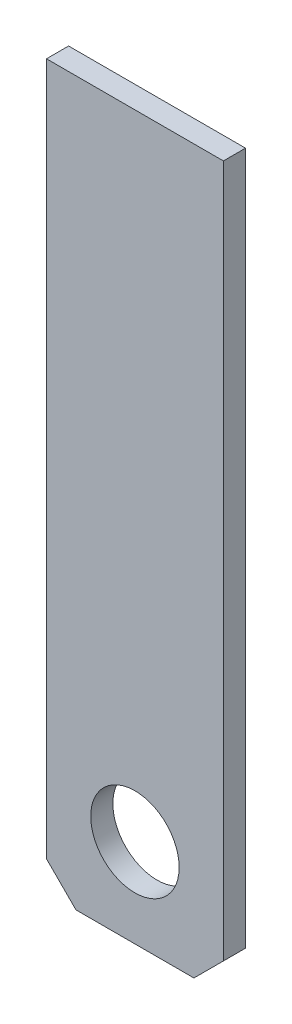
ISO-10303-21;
HEADER;
FILE_DESCRIPTION(('STEP AP214'),'2;1');
FILE_NAME('part.step','',(''),(''),'','','');
FILE_SCHEMA(('AUTOMOTIVE_DESIGN { 1 0 10303 214 1 1 1 1 }'));
ENDSEC;
DATA;
#1=APPLICATION_CONTEXT('core data for automotive mechanical design processes');
#2=APPLICATION_PROTOCOL_DEFINITION('international standard','automotive_design',2000,#1);
#3=PRODUCT_CONTEXT('',#1,'mechanical');
#4=PRODUCT('Part','Part','',(#3));
#5=PRODUCT_RELATED_PRODUCT_CATEGORY('part','',(#4));
#6=PRODUCT_DEFINITION_FORMATION('','',#4);
#7=PRODUCT_DEFINITION_CONTEXT('part definition',#1,'design');
#8=PRODUCT_DEFINITION('design','',#6,#7);
#9=PRODUCT_DEFINITION_SHAPE('','',#8);
#10=(LENGTH_UNIT() NAMED_UNIT(*) SI_UNIT(.MILLI.,.METRE.));
#11=(NAMED_UNIT(*) PLANE_ANGLE_UNIT() SI_UNIT($,.RADIAN.));
#12=(NAMED_UNIT(*) SI_UNIT($,.STERADIAN.) SOLID_ANGLE_UNIT());
#13=UNCERTAINTY_MEASURE_WITH_UNIT(LENGTH_MEASURE(1.E-05),#10,'distance_accuracy_value','');
#14=(GEOMETRIC_REPRESENTATION_CONTEXT(3) GLOBAL_UNCERTAINTY_ASSIGNED_CONTEXT((#13)) GLOBAL_UNIT_ASSIGNED_CONTEXT((#10,
#11,#12)) REPRESENTATION_CONTEXT('',''));
#15=CARTESIAN_POINT('',(0.,0.,0.));
#16=DIRECTION('',(0.,0.,1.));
#17=DIRECTION('',(1.,0.,0.));
#18=AXIS2_PLACEMENT_3D('',#15,#16,#17);
#19=CARTESIAN_POINT('',(0.,18.5,1.5));
#20=DIRECTION('',(0.,0.,1.));
#21=DIRECTION('',(1.,0.,0.));
#22=AXIS2_PLACEMENT_3D('',#19,#20,#21);
#23=PLANE('',#22);
#24=CARTESIAN_POINT('',(0.,0.,1.5));
#25=DIRECTION('',(0.,0.,1.));
#26=DIRECTION('',(1.,0.,0.));
#27=AXIS2_PLACEMENT_3D('',#24,#25,#26);
#28=CIRCLE('',#27,3.);
#29=CARTESIAN_POINT('',(3.,0.,1.5));
#30=VERTEX_POINT('',#29);
#31=EDGE_CURVE('E20',#30,#30,#28,.F.);
#32=ORIENTED_EDGE('',*,*,#31,.T.);
#33=EDGE_LOOP('',(#32));
#34=FACE_BOUND('',#33,.T.);
#35=DIRECTION('',(0.707106781186548,-0.707106781186547,0.));
#36=VECTOR('',#35,1.);
#37=CARTESIAN_POINT('',(-5.,-5.,1.5));
#38=LINE('',#37,#36);
#39=CARTESIAN_POINT('',(-4.,-6.,1.5));
#40=VERTEX_POINT('',#39);
#41=CARTESIAN_POINT('',(-6.00000000000001,-4.,1.5));
#42=VERTEX_POINT('',#41);
#43=EDGE_CURVE('E97',#40,#42,#38,.F.);
#44=ORIENTED_EDGE('',*,*,#43,.F.);
#45=DIRECTION('',(1.,0.,0.));
#46=VECTOR('',#45,1.);
#47=CARTESIAN_POINT('',(6.,-6.,1.5));
#48=LINE('',#47,#46);
#49=CARTESIAN_POINT('',(4.,-6.,1.5));
#50=VERTEX_POINT('',#49);
#51=EDGE_CURVE('E101',#50,#40,#48,.F.);
#52=ORIENTED_EDGE('',*,*,#51,.F.);
#53=DIRECTION('',(0.707106781186548,0.707106781186547,0.));
#54=VECTOR('',#53,1.);
#55=CARTESIAN_POINT('',(5.,-5.,1.5));
#56=LINE('',#55,#54);
#57=CARTESIAN_POINT('',(6.,-4.,1.5));
#58=VERTEX_POINT('',#57);
#59=EDGE_CURVE('E85',#58,#50,#56,.F.);
#60=ORIENTED_EDGE('',*,*,#59,.F.);
#61=DIRECTION('',(0.,1.,0.));
#62=VECTOR('',#61,1.);
#63=CARTESIAN_POINT('',(5.99999999999999,43.,1.5));
#64=LINE('',#63,#62);
#65=CARTESIAN_POINT('',(6.,43.,1.5));
#66=VERTEX_POINT('',#65);
#67=EDGE_CURVE('E80',#66,#58,#64,.F.);
#68=ORIENTED_EDGE('',*,*,#67,.F.);
#69=DIRECTION('',(1.,0.,0.));
#70=VECTOR('',#69,1.);
#71=CARTESIAN_POINT('',(-6.00000000000001,43.,1.5));
#72=LINE('',#71,#70);
#73=CARTESIAN_POINT('',(-6.00000000000001,43.,1.5));
#74=VERTEX_POINT('',#73);
#75=EDGE_CURVE('E71',#74,#66,#72,.T.);
#76=ORIENTED_EDGE('',*,*,#75,.F.);
#77=DIRECTION('',(0.,1.,0.));
#78=VECTOR('',#77,1.);
#79=CARTESIAN_POINT('',(-6.,-6.,1.5));
#80=LINE('',#79,#78);
#81=EDGE_CURVE('E66',#42,#74,#80,.T.);
#82=ORIENTED_EDGE('',*,*,#81,.F.);
#83=EDGE_LOOP('',(#44,#52,#60,#68,#76,#82));
#84=FACE_BOUND('',#83,.T.);
#85=ADVANCED_FACE('F17',(#34,#84),#23,.T.);
#86=CARTESIAN_POINT('',(5.99999999999999,43.,0.));
#87=DIRECTION('',(1.,0.,0.));
#88=DIRECTION('',(0.,0.,-1.));
#89=AXIS2_PLACEMENT_3D('',#86,#87,#88);
#90=PLANE('',#89);
#91=DIRECTION('',(0.,0.,1.));
#92=VECTOR('',#91,1.);
#93=CARTESIAN_POINT('',(5.99999999999999,43.,0.));
#94=LINE('',#93,#92);
#95=CARTESIAN_POINT('',(6.,43.,0.));
#96=VERTEX_POINT('',#95);
#97=EDGE_CURVE('E76',#66,#96,#94,.F.);
#98=ORIENTED_EDGE('',*,*,#97,.F.);
#99=ORIENTED_EDGE('',*,*,#67,.T.);
#100=DIRECTION('',(0.,0.,1.));
#101=VECTOR('',#100,1.);
#102=CARTESIAN_POINT('',(6.,-4.,0.));
#103=LINE('',#102,#101);
#104=CARTESIAN_POINT('',(6.,-4.00000000000001,0.));
#105=VERTEX_POINT('',#104);
#106=EDGE_CURVE('E107',#105,#58,#103,.T.);
#107=ORIENTED_EDGE('',*,*,#106,.F.);
#108=DIRECTION('',(0.,1.,0.));
#109=VECTOR('',#108,1.);
#110=CARTESIAN_POINT('',(6.,18.5,0.));
#111=LINE('',#110,#109);
#112=EDGE_CURVE('E92',#105,#96,#111,.T.);
#113=ORIENTED_EDGE('',*,*,#112,.T.);
#114=EDGE_LOOP('',(#98,#99,#107,#113));
#115=FACE_BOUND('',#114,.T.);
#116=ADVANCED_FACE('F91',(#115),#90,.T.);
#117=CARTESIAN_POINT('',(-6.00000000000001,43.,0.));
#118=DIRECTION('',(0.,1.,0.));
#119=DIRECTION('',(0.,0.,1.));
#120=AXIS2_PLACEMENT_3D('',#117,#118,#119);
#121=PLANE('',#120);
#122=DIRECTION('',(1.,0.,0.));
#123=VECTOR('',#122,1.);
#124=CARTESIAN_POINT('',(0.,43.,0.));
#125=LINE('',#124,#123);
#126=CARTESIAN_POINT('',(-6.00000000000001,43.,0.));
#127=VERTEX_POINT('',#126);
#128=EDGE_CURVE('E110',#96,#127,#125,.F.);
#129=ORIENTED_EDGE('',*,*,#128,.T.);
#130=DIRECTION('',(0.,0.,1.));
#131=VECTOR('',#130,1.);
#132=CARTESIAN_POINT('',(-6.,43.,0.));
#133=LINE('',#132,#131);
#134=EDGE_CURVE('E78',#74,#127,#133,.F.);
#135=ORIENTED_EDGE('',*,*,#134,.F.);
#136=ORIENTED_EDGE('',*,*,#75,.T.);
#137=ORIENTED_EDGE('',*,*,#97,.T.);
#138=EDGE_LOOP('',(#129,#135,#136,#137));
#139=FACE_BOUND('',#138,.T.);
#140=ADVANCED_FACE('F74',(#139),#121,.T.);
#141=CARTESIAN_POINT('',(-6.,-6.,0.));
#142=DIRECTION('',(-1.,0.,0.));
#143=DIRECTION('',(0.,0.,1.));
#144=AXIS2_PLACEMENT_3D('',#141,#142,#143);
#145=PLANE('',#144);
#146=ORIENTED_EDGE('',*,*,#134,.T.);
#147=DIRECTION('',(0.,1.,0.));
#148=VECTOR('',#147,1.);
#149=CARTESIAN_POINT('',(-6.00000000000001,18.5,0.));
#150=LINE('',#149,#148);
#151=CARTESIAN_POINT('',(-6.,-4.,0.));
#152=VERTEX_POINT('',#151);
#153=EDGE_CURVE('E112',#127,#152,#150,.F.);
#154=ORIENTED_EDGE('',*,*,#153,.T.);
#155=DIRECTION('',(0.,0.,1.));
#156=VECTOR('',#155,1.);
#157=CARTESIAN_POINT('',(-6.,-4.,0.));
#158=LINE('',#157,#156);
#159=EDGE_CURVE('E99',#42,#152,#158,.F.);
#160=ORIENTED_EDGE('',*,*,#159,.F.);
#161=ORIENTED_EDGE('',*,*,#81,.T.);
#162=EDGE_LOOP('',(#146,#154,#160,#161));
#163=FACE_BOUND('',#162,.T.);
#164=ADVANCED_FACE('F132',(#163),#145,.T.);
#165=CARTESIAN_POINT('',(-5.,-5.,0.));
#166=DIRECTION('',(-0.707106781186547,-0.707106781186548,0.));
#167=DIRECTION('',(0.707106781186548,-0.707106781186547,0.));
#168=AXIS2_PLACEMENT_3D('',#165,#166,#167);
#169=PLANE('',#168);
#170=DIRECTION('',(0.707106781186548,-0.707106781186547,0.));
#171=VECTOR('',#170,1.);
#172=CARTESIAN_POINT('',(-6.,-4.,0.));
#173=LINE('',#172,#171);
#174=CARTESIAN_POINT('',(-4.,-6.,0.));
#175=VERTEX_POINT('',#174);
#176=EDGE_CURVE('E115',#152,#175,#173,.T.);
#177=ORIENTED_EDGE('',*,*,#176,.T.);
#178=DIRECTION('',(0.,0.,-1.));
#179=VECTOR('',#178,1.);
#180=CARTESIAN_POINT('',(-4.,-6.,0.));
#181=LINE('',#180,#179);
#182=EDGE_CURVE('E103',#40,#175,#181,.T.);
#183=ORIENTED_EDGE('',*,*,#182,.F.);
#184=ORIENTED_EDGE('',*,*,#43,.T.);
#185=ORIENTED_EDGE('',*,*,#159,.T.);
#186=EDGE_LOOP('',(#177,#183,#184,#185));
#187=FACE_BOUND('',#186,.T.);
#188=ADVANCED_FACE('F130',(#187),#169,.T.);
#189=CARTESIAN_POINT('',(6.,-6.,0.));
#190=DIRECTION('',(0.,-1.,0.));
#191=DIRECTION('',(0.,0.,-1.));
#192=AXIS2_PLACEMENT_3D('',#189,#190,#191);
#193=PLANE('',#192);
#194=ORIENTED_EDGE('',*,*,#182,.T.);
#195=DIRECTION('',(1.,0.,0.));
#196=VECTOR('',#195,1.);
#197=CARTESIAN_POINT('',(0.,-6.,0.));
#198=LINE('',#197,#196);
#199=CARTESIAN_POINT('',(4.,-6.,0.));
#200=VERTEX_POINT('',#199);
#201=EDGE_CURVE('E118',#175,#200,#198,.T.);
#202=ORIENTED_EDGE('',*,*,#201,.T.);
#203=DIRECTION('',(0.,0.,1.));
#204=VECTOR('',#203,1.);
#205=CARTESIAN_POINT('',(4.,-6.,0.));
#206=LINE('',#205,#204);
#207=EDGE_CURVE('E34',#50,#200,#206,.F.);
#208=ORIENTED_EDGE('',*,*,#207,.F.);
#209=ORIENTED_EDGE('',*,*,#51,.T.);
#210=EDGE_LOOP('',(#194,#202,#208,#209));
#211=FACE_BOUND('',#210,.T.);
#212=ADVANCED_FACE('F127',(#211),#193,.T.);
#213=CARTESIAN_POINT('',(5.,-5.,0.));
#214=DIRECTION('',(0.707106781186547,-0.707106781186548,0.));
#215=DIRECTION('',(0.707106781186548,0.707106781186547,0.));
#216=AXIS2_PLACEMENT_3D('',#213,#214,#215);
#217=PLANE('',#216);
#218=DIRECTION('',(0.707106781186548,0.707106781186547,0.));
#219=VECTOR('',#218,1.);
#220=CARTESIAN_POINT('',(4.,-6.,0.));
#221=LINE('',#220,#219);
#222=EDGE_CURVE('E26',#200,#105,#221,.T.);
#223=ORIENTED_EDGE('',*,*,#222,.T.);
#224=ORIENTED_EDGE('',*,*,#106,.T.);
#225=ORIENTED_EDGE('',*,*,#59,.T.);
#226=ORIENTED_EDGE('',*,*,#207,.T.);
#227=EDGE_LOOP('',(#223,#224,#225,#226));
#228=FACE_BOUND('',#227,.T.);
#229=ADVANCED_FACE('F121',(#228),#217,.T.);
#230=CARTESIAN_POINT('',(0.,0.,0.));
#231=DIRECTION('',(0.,0.,1.));
#232=DIRECTION('',(1.,0.,0.));
#233=AXIS2_PLACEMENT_3D('',#230,#231,#232);
#234=CYLINDRICAL_SURFACE('',#233,3.);
#235=CARTESIAN_POINT('',(0.,0.,0.));
#236=DIRECTION('',(0.,0.,1.));
#237=DIRECTION('',(1.,0.,0.));
#238=AXIS2_PLACEMENT_3D('',#235,#236,#237);
#239=CIRCLE('',#238,3.);
#240=CARTESIAN_POINT('',(3.,0.,0.));
#241=VERTEX_POINT('',#240);
#242=EDGE_CURVE('E11',#241,#241,#239,.F.);
#243=ORIENTED_EDGE('',*,*,#242,.T.);
#244=EDGE_LOOP('',(#243));
#245=FACE_BOUND('',#244,.T.);
#246=ORIENTED_EDGE('',*,*,#31,.F.);
#247=EDGE_LOOP('',(#246));
#248=FACE_BOUND('',#247,.T.);
#249=ADVANCED_FACE('F143',(#245,#248),#234,.F.);
#250=CARTESIAN_POINT('',(0.,18.5,0.));
#251=DIRECTION('',(0.,0.,1.));
#252=DIRECTION('',(1.,0.,0.));
#253=AXIS2_PLACEMENT_3D('',#250,#251,#252);
#254=PLANE('',#253);
#255=ORIENTED_EDGE('',*,*,#242,.F.);
#256=EDGE_LOOP('',(#255));
#257=FACE_BOUND('',#256,.T.);
#258=ORIENTED_EDGE('',*,*,#201,.F.);
#259=ORIENTED_EDGE('',*,*,#176,.F.);
#260=ORIENTED_EDGE('',*,*,#153,.F.);
#261=ORIENTED_EDGE('',*,*,#128,.F.);
#262=ORIENTED_EDGE('',*,*,#112,.F.);
#263=ORIENTED_EDGE('',*,*,#222,.F.);
#264=EDGE_LOOP('',(#258,#259,#260,#261,#262,#263));
#265=FACE_BOUND('',#264,.T.);
#266=ADVANCED_FACE('F124',(#257,#265),#254,.F.);
#267=CLOSED_SHELL('',(#85,#116,#140,#164,#188,#212,#229,#249,#266));
#268=MANIFOLD_SOLID_BREP('B1',#267);
#269=ADVANCED_BREP_SHAPE_REPRESENTATION('',(#18,#268),#14);
#270=SHAPE_DEFINITION_REPRESENTATION(#9,#269);
ENDSEC;
END-ISO-10303-21;
